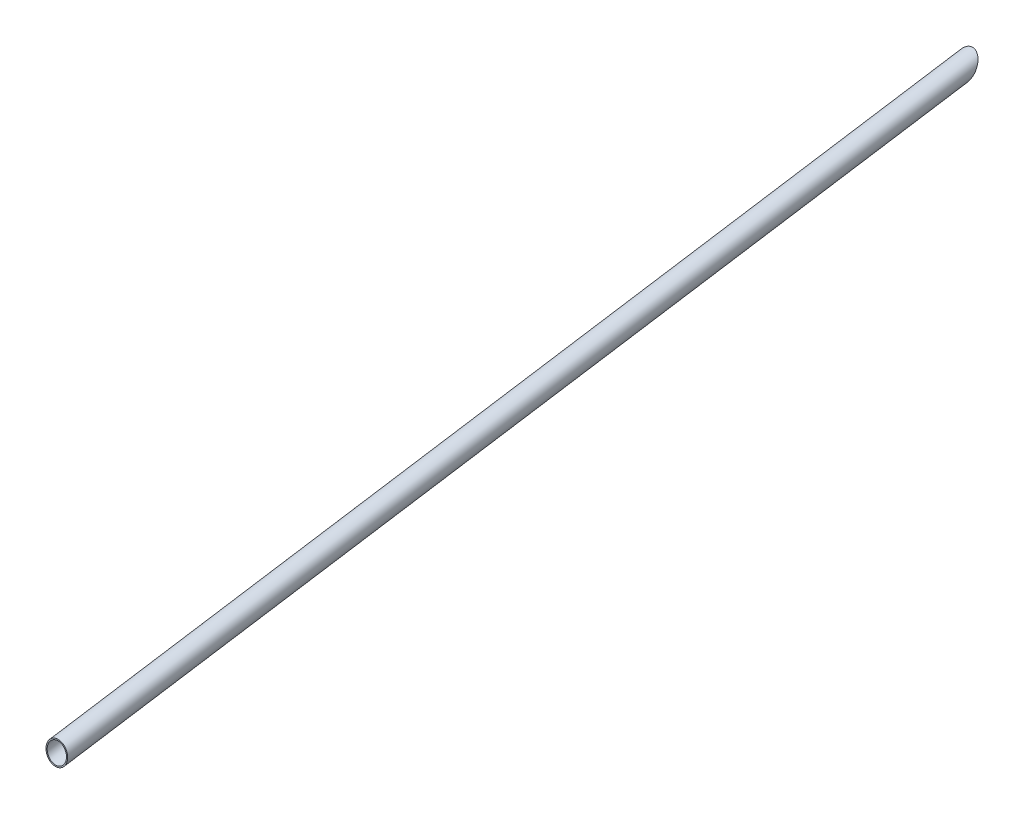
ISO-10303-21;
HEADER;
FILE_DESCRIPTION(('STEP AP214'),'2;1');
FILE_NAME('part.step','',(''),(''),'','','');
FILE_SCHEMA(('AUTOMOTIVE_DESIGN { 1 0 10303 214 1 1 1 1 }'));
ENDSEC;
DATA;
#1=APPLICATION_CONTEXT('core data for automotive mechanical design processes');
#2=APPLICATION_PROTOCOL_DEFINITION('international standard','automotive_design',2000,#1);
#3=PRODUCT_CONTEXT('',#1,'mechanical');
#4=PRODUCT('Part','Part','',(#3));
#5=PRODUCT_RELATED_PRODUCT_CATEGORY('part','',(#4));
#6=PRODUCT_DEFINITION_FORMATION('','',#4);
#7=PRODUCT_DEFINITION_CONTEXT('part definition',#1,'design');
#8=PRODUCT_DEFINITION('design','',#6,#7);
#9=PRODUCT_DEFINITION_SHAPE('','',#8);
#10=(LENGTH_UNIT() NAMED_UNIT(*) SI_UNIT(.MILLI.,.METRE.));
#11=(NAMED_UNIT(*) PLANE_ANGLE_UNIT() SI_UNIT($,.RADIAN.));
#12=(NAMED_UNIT(*) SI_UNIT($,.STERADIAN.) SOLID_ANGLE_UNIT());
#13=UNCERTAINTY_MEASURE_WITH_UNIT(LENGTH_MEASURE(1.E-05),#10,'distance_accuracy_value','');
#14=(GEOMETRIC_REPRESENTATION_CONTEXT(3) GLOBAL_UNCERTAINTY_ASSIGNED_CONTEXT((#13)) GLOBAL_UNIT_ASSIGNED_CONTEXT((#10,
#11,#12)) REPRESENTATION_CONTEXT('',''));
#15=CARTESIAN_POINT('',(0.,0.,0.));
#16=DIRECTION('',(0.,0.,1.));
#17=DIRECTION('',(1.,0.,0.));
#18=AXIS2_PLACEMENT_3D('',#15,#16,#17);
#19=CARTESIAN_POINT('',(150.,2.22044604925031E-13,-825.));
#20=DIRECTION('',(0.20871080944,0.381642622975999,-0.900438063583998));
#21=DIRECTION('',(0.,0.920714591276893,0.390236647958419));
#22=AXIS2_PLACEMENT_3D('',#19,#20,#21);
#23=CYLINDRICAL_SURFACE('',#22,9.79999999999998);
#24=CARTESIAN_POINT('',(150.,1.79159353021816E-13,-825.));
#25=DIRECTION('',(-0.0197141066523152,0.0461644942318043,0.998739302055958));
#26=DIRECTION('',(0.412111349099456,0.910500714966001,-0.033951200123519));
#27=AXIS2_PLACEMENT_3D('',#24,#25,#26);
#28=ELLIPSE('',#27,11.0634568180166,9.79999999999998);
#29=CARTESIAN_POINT('',(154.559376114976,10.0732853427998,-825.375617636486));
#30=VERTEX_POINT('',#29);
#31=EDGE_CURVE('E53',#30,#30,#28,.T.);
#32=ORIENTED_EDGE('',*,*,#31,.T.);
#33=EDGE_LOOP('',(#32));
#34=FACE_BOUND('',#33,.T.);
#35=CARTESIAN_POINT('',(325.,320.,-1580.));
#36=DIRECTION('',(-0.00416950723616232,-0.393939167319851,-0.919127057408686));
#37=DIRECTION('',(0.2871987901008,0.87994037819309,-0.37844654284329));
#38=AXIS2_PLACEMENT_3D('',#35,#36,#37);
#39=ELLIPSE('',#38,14.4884086128331,9.79999999999998);
#40=CARTESIAN_POINT('',(329.161053424092,332.748935754193,-1585.48308815083));
#41=VERTEX_POINT('',#40);
#42=EDGE_CURVE('E43',#41,#41,#39,.T.);
#43=ORIENTED_EDGE('',*,*,#42,.T.);
#44=EDGE_LOOP('',(#43));
#45=FACE_BOUND('',#44,.T.);
#46=ADVANCED_FACE('F39',(#34,#45),#23,.F.);
#47=CARTESIAN_POINT('',(150.,2.22044604925031E-13,-825.));
#48=DIRECTION('',(0.20871080944,0.381642622975999,-0.900438063583998));
#49=DIRECTION('',(0.,0.920714591276893,0.390236647958419));
#50=AXIS2_PLACEMENT_3D('',#47,#48,#49);
#51=CYLINDRICAL_SURFACE('',#50,11.);
#52=CARTESIAN_POINT('',(150.,1.79159353021816E-13,-825.));
#53=DIRECTION('',(-0.0197141066523152,0.0461644942318043,0.998739302055958));
#54=DIRECTION('',(0.412111349099456,0.910500714966001,-0.033951200123519));
#55=AXIS2_PLACEMENT_3D('',#52,#53,#54);
#56=ELLIPSE('',#55,12.4181658161411,11.);
#57=CARTESIAN_POINT('',(155.11766706783,11.306748854163,-825.421611632791));
#58=VERTEX_POINT('',#57);
#59=EDGE_CURVE('E47',#58,#58,#56,.T.);
#60=ORIENTED_EDGE('',*,*,#59,.F.);
#61=EDGE_LOOP('',(#60));
#62=FACE_BOUND('',#61,.T.);
#63=CARTESIAN_POINT('',(325.,320.,-1580.));
#64=DIRECTION('',(-0.00416950723616232,-0.393939167319851,-0.919127057408686));
#65=DIRECTION('',(0.2871987901008,0.87994037819309,-0.37844654284329));
#66=AXIS2_PLACEMENT_3D('',#63,#64,#65);
#67=ELLIPSE('',#66,16.2624994633842,11.);
#68=CARTESIAN_POINT('',(329.670570169899,334.310029928175,-1586.15448669991));
#69=VERTEX_POINT('',#68);
#70=EDGE_CURVE('E10',#69,#69,#67,.T.);
#71=ORIENTED_EDGE('',*,*,#70,.F.);
#72=EDGE_LOOP('',(#71));
#73=FACE_BOUND('',#72,.T.);
#74=ADVANCED_FACE('F67',(#62,#73),#51,.T.);
#75=CARTESIAN_POINT('',(150.,0.,-825.));
#76=DIRECTION('',(-0.0197141066523152,0.0461644942318043,0.998739302055958));
#77=DIRECTION('',(0.,-0.998933436662963,0.0461734676705454));
#78=AXIS2_PLACEMENT_3D('',#75,#76,#77);
#79=PLANE('',#78);
#80=ORIENTED_EDGE('',*,*,#31,.F.);
#81=EDGE_LOOP('',(#80));
#82=FACE_BOUND('',#81,.T.);
#83=ORIENTED_EDGE('',*,*,#59,.T.);
#84=EDGE_LOOP('',(#83));
#85=FACE_BOUND('',#84,.T.);
#86=ADVANCED_FACE('F62',(#82,#85),#79,.T.);
#87=CARTESIAN_POINT('',(325.,320.,-1580.));
#88=DIRECTION('',(-0.00416950723616232,-0.393939167319851,-0.919127057408686));
#89=DIRECTION('',(0.,0.919135046928569,-0.393942591639465));
#90=AXIS2_PLACEMENT_3D('',#87,#88,#89);
#91=PLANE('',#90);
#92=ORIENTED_EDGE('',*,*,#42,.F.);
#93=EDGE_LOOP('',(#92));
#94=FACE_BOUND('',#93,.T.);
#95=ORIENTED_EDGE('',*,*,#70,.T.);
#96=EDGE_LOOP('',(#95));
#97=FACE_BOUND('',#96,.T.);
#98=ADVANCED_FACE('F41',(#94,#97),#91,.T.);
#99=CLOSED_SHELL('',(#46,#74,#86,#98));
#100=MANIFOLD_SOLID_BREP('B2',#99);
#101=ADVANCED_BREP_SHAPE_REPRESENTATION('',(#18,#100),#14);
#102=SHAPE_DEFINITION_REPRESENTATION(#9,#101);
ENDSEC;
END-ISO-10303-21;
